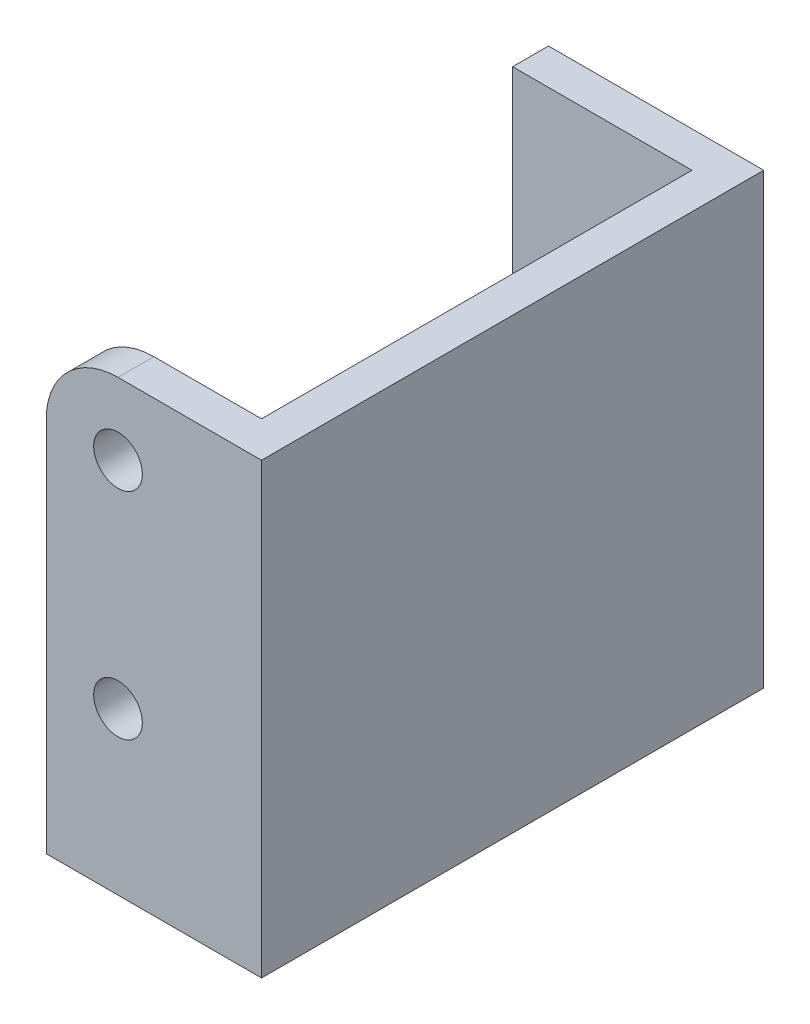
ISO-10303-21;
HEADER;
FILE_DESCRIPTION(('STEP AP214'),'2;1');
FILE_NAME('part.step','',(''),(''),'','','');
FILE_SCHEMA(('AUTOMOTIVE_DESIGN { 1 0 10303 214 1 1 1 1 }'));
ENDSEC;
DATA;
#1=APPLICATION_CONTEXT('core data for automotive mechanical design processes');
#2=APPLICATION_PROTOCOL_DEFINITION('international standard','automotive_design',2000,#1);
#3=PRODUCT_CONTEXT('',#1,'mechanical');
#4=PRODUCT('Part','Part','',(#3));
#5=PRODUCT_RELATED_PRODUCT_CATEGORY('part','',(#4));
#6=PRODUCT_DEFINITION_FORMATION('','',#4);
#7=PRODUCT_DEFINITION_CONTEXT('part definition',#1,'design');
#8=PRODUCT_DEFINITION('design','',#6,#7);
#9=PRODUCT_DEFINITION_SHAPE('','',#8);
#10=(LENGTH_UNIT() NAMED_UNIT(*) SI_UNIT(.MILLI.,.METRE.));
#11=(NAMED_UNIT(*) PLANE_ANGLE_UNIT() SI_UNIT($,.RADIAN.));
#12=(NAMED_UNIT(*) SI_UNIT($,.STERADIAN.) SOLID_ANGLE_UNIT());
#13=UNCERTAINTY_MEASURE_WITH_UNIT(LENGTH_MEASURE(1.E-05),#10,'distance_accuracy_value','');
#14=(GEOMETRIC_REPRESENTATION_CONTEXT(3) GLOBAL_UNCERTAINTY_ASSIGNED_CONTEXT((#13)) GLOBAL_UNIT_ASSIGNED_CONTEXT((#10,
#11,#12)) REPRESENTATION_CONTEXT('',''));
#15=CARTESIAN_POINT('',(0.,0.,0.));
#16=DIRECTION('',(0.,0.,1.));
#17=DIRECTION('',(1.,0.,0.));
#18=AXIS2_PLACEMENT_3D('',#15,#16,#17);
#19=CARTESIAN_POINT('',(-9.525,19.84375,-44.45));
#20=DIRECTION('',(-1.,0.,0.));
#21=DIRECTION('',(0.,-1.,0.));
#22=AXIS2_PLACEMENT_3D('',#19,#20,#21);
#23=PLANE('',#22);
#24=DIRECTION('',(0.,-1.,0.));
#25=VECTOR('',#24,1.);
#26=CARTESIAN_POINT('',(-9.525,19.84375,0.));
#27=LINE('',#26,#25);
#28=CARTESIAN_POINT('',(-9.525,13.49375,0.));
#29=VERTEX_POINT('',#28);
#30=CARTESIAN_POINT('',(-9.525,-19.84375,0.));
#31=VERTEX_POINT('',#30);
#32=EDGE_CURVE('E186',#29,#31,#27,.T.);
#33=ORIENTED_EDGE('',*,*,#32,.F.);
#34=DIRECTION('',(0.,0.,1.));
#35=VECTOR('',#34,1.);
#36=CARTESIAN_POINT('',(-9.525,13.49375,-44.45));
#37=LINE('',#36,#35);
#38=CARTESIAN_POINT('',(-9.525,13.49375,-3.175));
#39=VERTEX_POINT('',#38);
#40=EDGE_CURVE('E52',#29,#39,#37,.F.);
#41=ORIENTED_EDGE('',*,*,#40,.T.);
#42=DIRECTION('',(0.,-1.,0.));
#43=VECTOR('',#42,1.);
#44=CARTESIAN_POINT('',(-9.525,0.,-3.175));
#45=LINE('',#44,#43);
#46=CARTESIAN_POINT('',(-9.525,-16.66875,-3.175));
#47=VERTEX_POINT('',#46);
#48=EDGE_CURVE('E154',#39,#47,#45,.T.);
#49=ORIENTED_EDGE('',*,*,#48,.T.);
#50=DIRECTION('',(0.,0.,1.));
#51=VECTOR('',#50,1.);
#52=CARTESIAN_POINT('',(-9.525,-16.66875,-44.45));
#53=LINE('',#52,#51);
#54=CARTESIAN_POINT('',(-9.525,-16.66875,-41.275));
#55=VERTEX_POINT('',#54);
#56=EDGE_CURVE('E127',#55,#47,#53,.T.);
#57=ORIENTED_EDGE('',*,*,#56,.F.);
#58=DIRECTION('',(0.,-1.,0.));
#59=VECTOR('',#58,1.);
#60=CARTESIAN_POINT('',(-9.525,0.,-41.275));
#61=LINE('',#60,#59);
#62=CARTESIAN_POINT('',(-9.525,19.84375,-41.275));
#63=VERTEX_POINT('',#62);
#64=EDGE_CURVE('E141',#63,#55,#61,.T.);
#65=ORIENTED_EDGE('',*,*,#64,.F.);
#66=DIRECTION('',(0.,0.,1.));
#67=VECTOR('',#66,1.);
#68=CARTESIAN_POINT('',(-9.525,19.84375,-44.45));
#69=LINE('',#68,#67);
#70=CARTESIAN_POINT('',(-9.525,19.84375,-44.45));
#71=VERTEX_POINT('',#70);
#72=EDGE_CURVE('E200',#71,#63,#69,.T.);
#73=ORIENTED_EDGE('',*,*,#72,.F.);
#74=DIRECTION('',(0.,-1.,0.));
#75=VECTOR('',#74,1.);
#76=CARTESIAN_POINT('',(-9.525,19.84375,-44.45));
#77=LINE('',#76,#75);
#78=CARTESIAN_POINT('',(-9.525,-19.84375,-44.45));
#79=VERTEX_POINT('',#78);
#80=EDGE_CURVE('E171',#71,#79,#77,.T.);
#81=ORIENTED_EDGE('',*,*,#80,.T.);
#82=DIRECTION('',(0.,0.,1.));
#83=VECTOR('',#82,1.);
#84=CARTESIAN_POINT('',(-9.525,-19.84375,-44.45));
#85=LINE('',#84,#83);
#86=EDGE_CURVE('E196',#79,#31,#85,.T.);
#87=ORIENTED_EDGE('',*,*,#86,.T.);
#88=EDGE_LOOP('',(#33,#41,#49,#57,#65,#73,#81,#87));
#89=FACE_BOUND('',#88,.T.);
#90=ADVANCED_FACE('F43',(#89),#23,.T.);
#91=CARTESIAN_POINT('',(-9.525,19.84375,-44.45));
#92=DIRECTION('',(0.,1.,0.));
#93=DIRECTION('',(0.,0.,1.));
#94=AXIS2_PLACEMENT_3D('',#91,#92,#93);
#95=PLANE('',#94);
#96=DIRECTION('',(-1.,0.,0.));
#97=VECTOR('',#96,1.);
#98=CARTESIAN_POINT('',(0.,19.84375,-3.175));
#99=LINE('',#98,#97);
#100=CARTESIAN_POINT('',(6.35,19.84375,-3.175));
#101=VERTEX_POINT('',#100);
#102=CARTESIAN_POINT('',(-3.175,19.84375,-3.175));
#103=VERTEX_POINT('',#102);
#104=EDGE_CURVE('E157',#101,#103,#99,.T.);
#105=ORIENTED_EDGE('',*,*,#104,.T.);
#106=DIRECTION('',(0.,0.,1.));
#107=VECTOR('',#106,1.);
#108=CARTESIAN_POINT('',(-3.175,19.84375,-44.45));
#109=LINE('',#108,#107);
#110=CARTESIAN_POINT('',(-3.175,19.84375,0.));
#111=VERTEX_POINT('',#110);
#112=EDGE_CURVE('E195',#103,#111,#109,.T.);
#113=ORIENTED_EDGE('',*,*,#112,.T.);
#114=DIRECTION('',(-1.,0.,0.));
#115=VECTOR('',#114,1.);
#116=CARTESIAN_POINT('',(-9.525,19.84375,0.));
#117=LINE('',#116,#115);
#118=CARTESIAN_POINT('',(9.525,19.84375,0.));
#119=VERTEX_POINT('',#118);
#120=EDGE_CURVE('E183',#119,#111,#117,.T.);
#121=ORIENTED_EDGE('',*,*,#120,.F.);
#122=DIRECTION('',(0.,0.,1.));
#123=VECTOR('',#122,1.);
#124=CARTESIAN_POINT('',(9.525,19.84375,-44.45));
#125=LINE('',#124,#123);
#126=CARTESIAN_POINT('',(9.525,19.84375,-44.45));
#127=VERTEX_POINT('',#126);
#128=EDGE_CURVE('E179',#127,#119,#125,.T.);
#129=ORIENTED_EDGE('',*,*,#128,.F.);
#130=DIRECTION('',(-1.,0.,0.));
#131=VECTOR('',#130,1.);
#132=CARTESIAN_POINT('',(-9.525,19.84375,-44.45));
#133=LINE('',#132,#131);
#134=EDGE_CURVE('E166',#127,#71,#133,.T.);
#135=ORIENTED_EDGE('',*,*,#134,.T.);
#136=ORIENTED_EDGE('',*,*,#72,.T.);
#137=DIRECTION('',(-1.,0.,0.));
#138=VECTOR('',#137,1.);
#139=CARTESIAN_POINT('',(0.,19.84375,-41.275));
#140=LINE('',#139,#138);
#141=CARTESIAN_POINT('',(6.35,19.84375,-41.275));
#142=VERTEX_POINT('',#141);
#143=EDGE_CURVE('E137',#142,#63,#140,.T.);
#144=ORIENTED_EDGE('',*,*,#143,.F.);
#145=DIRECTION('',(0.,0.,1.));
#146=VECTOR('',#145,1.);
#147=CARTESIAN_POINT('',(6.35,19.84375,-44.45));
#148=LINE('',#147,#146);
#149=EDGE_CURVE('E133',#142,#101,#148,.T.);
#150=ORIENTED_EDGE('',*,*,#149,.T.);
#151=EDGE_LOOP('',(#105,#113,#121,#129,#135,#136,#144,#150));
#152=FACE_BOUND('',#151,.T.);
#153=ADVANCED_FACE('F214',(#152),#95,.T.);
#154=CARTESIAN_POINT('',(9.525,19.84375,-44.45));
#155=DIRECTION('',(1.,0.,0.));
#156=DIRECTION('',(0.,1.,0.));
#157=AXIS2_PLACEMENT_3D('',#154,#155,#156);
#158=PLANE('',#157);
#159=DIRECTION('',(0.,1.,0.));
#160=VECTOR('',#159,1.);
#161=CARTESIAN_POINT('',(9.525,19.84375,0.));
#162=LINE('',#161,#160);
#163=CARTESIAN_POINT('',(9.525,-19.84375,0.));
#164=VERTEX_POINT('',#163);
#165=EDGE_CURVE('E126',#164,#119,#162,.T.);
#166=ORIENTED_EDGE('',*,*,#165,.F.);
#167=DIRECTION('',(0.,0.,1.));
#168=VECTOR('',#167,1.);
#169=CARTESIAN_POINT('',(9.525,-19.84375,-44.45));
#170=LINE('',#169,#168);
#171=CARTESIAN_POINT('',(9.525,-19.84375,-44.45));
#172=VERTEX_POINT('',#171);
#173=EDGE_CURVE('E192',#172,#164,#170,.T.);
#174=ORIENTED_EDGE('',*,*,#173,.F.);
#175=DIRECTION('',(0.,1.,0.));
#176=VECTOR('',#175,1.);
#177=CARTESIAN_POINT('',(9.525,19.84375,-44.45));
#178=LINE('',#177,#176);
#179=EDGE_CURVE('E162',#172,#127,#178,.T.);
#180=ORIENTED_EDGE('',*,*,#179,.T.);
#181=ORIENTED_EDGE('',*,*,#128,.T.);
#182=EDGE_LOOP('',(#166,#174,#180,#181));
#183=FACE_BOUND('',#182,.T.);
#184=ADVANCED_FACE('F221',(#183),#158,.T.);
#185=CARTESIAN_POINT('',(-9.525,-19.84375,-44.45));
#186=DIRECTION('',(0.,-1.,0.));
#187=DIRECTION('',(0.,0.,-1.));
#188=AXIS2_PLACEMENT_3D('',#185,#186,#187);
#189=PLANE('',#188);
#190=DIRECTION('',(1.,0.,0.));
#191=VECTOR('',#190,1.);
#192=CARTESIAN_POINT('',(-9.525,-19.84375,0.));
#193=LINE('',#192,#191);
#194=EDGE_CURVE('E167',#31,#164,#193,.T.);
#195=ORIENTED_EDGE('',*,*,#194,.F.);
#196=ORIENTED_EDGE('',*,*,#86,.F.);
#197=DIRECTION('',(1.,0.,0.));
#198=VECTOR('',#197,1.);
#199=CARTESIAN_POINT('',(-9.525,-19.84375,-44.45));
#200=LINE('',#199,#198);
#201=EDGE_CURVE('E175',#79,#172,#200,.T.);
#202=ORIENTED_EDGE('',*,*,#201,.T.);
#203=ORIENTED_EDGE('',*,*,#173,.T.);
#204=EDGE_LOOP('',(#195,#196,#202,#203));
#205=FACE_BOUND('',#204,.T.);
#206=ADVANCED_FACE('F273',(#205),#189,.T.);
#207=CARTESIAN_POINT('',(0.,0.,-44.45));
#208=DIRECTION('',(0.,0.,1.));
#209=DIRECTION('',(1.,0.,0.));
#210=AXIS2_PLACEMENT_3D('',#207,#208,#209);
#211=PLANE('',#210);
#212=ORIENTED_EDGE('',*,*,#179,.F.);
#213=ORIENTED_EDGE('',*,*,#201,.F.);
#214=ORIENTED_EDGE('',*,*,#80,.F.);
#215=ORIENTED_EDGE('',*,*,#134,.F.);
#216=EDGE_LOOP('',(#212,#213,#214,#215));
#217=FACE_BOUND('',#216,.T.);
#218=ADVANCED_FACE('F226',(#217),#211,.F.);
#219=CARTESIAN_POINT('',(0.,0.,0.));
#220=DIRECTION('',(0.,0.,1.));
#221=DIRECTION('',(1.,0.,0.));
#222=AXIS2_PLACEMENT_3D('',#219,#220,#221);
#223=PLANE('',#222);
#224=CARTESIAN_POINT('',(-3.175,-5.55625,0.));
#225=DIRECTION('',(0.,0.,1.));
#226=DIRECTION('',(1.,0.,0.));
#227=AXIS2_PLACEMENT_3D('',#224,#225,#226);
#228=CIRCLE('',#227,2.15265);
#229=CARTESIAN_POINT('',(-1.02235,-5.55625,0.));
#230=VERTEX_POINT('',#229);
#231=EDGE_CURVE('E237',#230,#230,#228,.T.);
#232=ORIENTED_EDGE('',*,*,#231,.F.);
#233=EDGE_LOOP('',(#232));
#234=FACE_BOUND('',#233,.T.);
#235=CARTESIAN_POINT('',(-3.175,13.49375,0.));
#236=DIRECTION('',(0.,0.,1.));
#237=DIRECTION('',(1.,0.,0.));
#238=AXIS2_PLACEMENT_3D('',#235,#236,#237);
#239=CIRCLE('',#238,2.15265);
#240=CARTESIAN_POINT('',(-1.02235,13.49375,0.));
#241=VERTEX_POINT('',#240);
#242=EDGE_CURVE('E241',#241,#241,#239,.T.);
#243=ORIENTED_EDGE('',*,*,#242,.F.);
#244=EDGE_LOOP('',(#243));
#245=FACE_BOUND('',#244,.T.);
#246=ORIENTED_EDGE('',*,*,#120,.T.);
#247=CARTESIAN_POINT('',(-3.175,13.49375,0.));
#248=DIRECTION('',(0.,0.,1.));
#249=DIRECTION('',(1.,0.,0.));
#250=AXIS2_PLACEMENT_3D('',#247,#248,#249);
#251=CIRCLE('',#250,6.35);
#252=EDGE_CURVE('E66',#111,#29,#251,.T.);
#253=ORIENTED_EDGE('',*,*,#252,.T.);
#254=ORIENTED_EDGE('',*,*,#32,.T.);
#255=ORIENTED_EDGE('',*,*,#194,.T.);
#256=ORIENTED_EDGE('',*,*,#165,.T.);
#257=EDGE_LOOP('',(#246,#253,#254,#255,#256));
#258=FACE_BOUND('',#257,.T.);
#259=ADVANCED_FACE('F217',(#234,#245,#258),#223,.T.);
#260=CARTESIAN_POINT('',(6.35,19.84375,-44.45));
#261=DIRECTION('',(1.,0.,0.));
#262=DIRECTION('',(0.,1.,0.));
#263=AXIS2_PLACEMENT_3D('',#260,#261,#262);
#264=PLANE('',#263);
#265=DIRECTION('',(0.,1.,0.));
#266=VECTOR('',#265,1.);
#267=CARTESIAN_POINT('',(6.35,0.,-3.175));
#268=LINE('',#267,#266);
#269=CARTESIAN_POINT('',(6.35,-16.66875,-3.175));
#270=VERTEX_POINT('',#269);
#271=EDGE_CURVE('E161',#270,#101,#268,.T.);
#272=ORIENTED_EDGE('',*,*,#271,.T.);
#273=ORIENTED_EDGE('',*,*,#149,.F.);
#274=DIRECTION('',(0.,1.,0.));
#275=VECTOR('',#274,1.);
#276=CARTESIAN_POINT('',(6.35,0.,-41.275));
#277=LINE('',#276,#275);
#278=CARTESIAN_POINT('',(6.35,-16.66875,-41.275));
#279=VERTEX_POINT('',#278);
#280=EDGE_CURVE('E130',#279,#142,#277,.T.);
#281=ORIENTED_EDGE('',*,*,#280,.F.);
#282=DIRECTION('',(0.,0.,1.));
#283=VECTOR('',#282,1.);
#284=CARTESIAN_POINT('',(6.35,-16.66875,-44.45));
#285=LINE('',#284,#283);
#286=EDGE_CURVE('E113',#279,#270,#285,.T.);
#287=ORIENTED_EDGE('',*,*,#286,.T.);
#288=EDGE_LOOP('',(#272,#273,#281,#287));
#289=FACE_BOUND('',#288,.T.);
#290=ADVANCED_FACE('F131',(#289),#264,.F.);
#291=CARTESIAN_POINT('',(-9.525,-16.66875,-44.45));
#292=DIRECTION('',(0.,-1.,0.));
#293=DIRECTION('',(0.,0.,-1.));
#294=AXIS2_PLACEMENT_3D('',#291,#292,#293);
#295=PLANE('',#294);
#296=DIRECTION('',(1.,0.,0.));
#297=VECTOR('',#296,1.);
#298=CARTESIAN_POINT('',(0.,-16.66875,-3.175));
#299=LINE('',#298,#297);
#300=EDGE_CURVE('E121',#47,#270,#299,.T.);
#301=ORIENTED_EDGE('',*,*,#300,.T.);
#302=ORIENTED_EDGE('',*,*,#286,.F.);
#303=DIRECTION('',(1.,0.,0.));
#304=VECTOR('',#303,1.);
#305=CARTESIAN_POINT('',(0.,-16.66875,-41.275));
#306=LINE('',#305,#304);
#307=EDGE_CURVE('E118',#55,#279,#306,.T.);
#308=ORIENTED_EDGE('',*,*,#307,.F.);
#309=ORIENTED_EDGE('',*,*,#56,.T.);
#310=EDGE_LOOP('',(#301,#302,#308,#309));
#311=FACE_BOUND('',#310,.T.);
#312=ADVANCED_FACE('F115',(#311),#295,.F.);
#313=CARTESIAN_POINT('',(0.,0.,-41.275));
#314=DIRECTION('',(0.,0.,1.));
#315=DIRECTION('',(1.,0.,0.));
#316=AXIS2_PLACEMENT_3D('',#313,#314,#315);
#317=PLANE('',#316);
#318=ORIENTED_EDGE('',*,*,#280,.T.);
#319=ORIENTED_EDGE('',*,*,#143,.T.);
#320=ORIENTED_EDGE('',*,*,#64,.T.);
#321=ORIENTED_EDGE('',*,*,#307,.T.);
#322=EDGE_LOOP('',(#318,#319,#320,#321));
#323=FACE_BOUND('',#322,.T.);
#324=ADVANCED_FACE('F139',(#323),#317,.T.);
#325=CARTESIAN_POINT('',(0.,0.,-3.175));
#326=DIRECTION('',(0.,0.,1.));
#327=DIRECTION('',(1.,0.,0.));
#328=AXIS2_PLACEMENT_3D('',#325,#326,#327);
#329=PLANE('',#328);
#330=CARTESIAN_POINT('',(-3.175,-5.55625,-3.175));
#331=DIRECTION('',(0.,0.,1.));
#332=DIRECTION('',(1.,0.,0.));
#333=AXIS2_PLACEMENT_3D('',#330,#331,#332);
#334=CIRCLE('',#333,2.15265);
#335=CARTESIAN_POINT('',(-1.02235,-5.55625,-3.175));
#336=VERTEX_POINT('',#335);
#337=EDGE_CURVE('E233',#336,#336,#334,.F.);
#338=ORIENTED_EDGE('',*,*,#337,.F.);
#339=EDGE_LOOP('',(#338));
#340=FACE_BOUND('',#339,.T.);
#341=CARTESIAN_POINT('',(-3.175,13.49375,-3.175));
#342=DIRECTION('',(0.,0.,1.));
#343=DIRECTION('',(1.,0.,0.));
#344=AXIS2_PLACEMENT_3D('',#341,#342,#343);
#345=CIRCLE('',#344,2.15265);
#346=CARTESIAN_POINT('',(-1.02235,13.49375,-3.175));
#347=VERTEX_POINT('',#346);
#348=EDGE_CURVE('E245',#347,#347,#345,.F.);
#349=ORIENTED_EDGE('',*,*,#348,.F.);
#350=EDGE_LOOP('',(#349));
#351=FACE_BOUND('',#350,.T.);
#352=ORIENTED_EDGE('',*,*,#48,.F.);
#353=CARTESIAN_POINT('',(-3.175,13.49375,-3.175));
#354=DIRECTION('',(0.,0.,1.));
#355=DIRECTION('',(1.,0.,0.));
#356=AXIS2_PLACEMENT_3D('',#353,#354,#355);
#357=CIRCLE('',#356,6.35);
#358=EDGE_CURVE('E11',#39,#103,#357,.F.);
#359=ORIENTED_EDGE('',*,*,#358,.T.);
#360=ORIENTED_EDGE('',*,*,#104,.F.);
#361=ORIENTED_EDGE('',*,*,#271,.F.);
#362=ORIENTED_EDGE('',*,*,#300,.F.);
#363=EDGE_LOOP('',(#352,#359,#360,#361,#362));
#364=FACE_BOUND('',#363,.T.);
#365=ADVANCED_FACE('F229',(#340,#351,#364),#329,.F.);
#366=CARTESIAN_POINT('',(-3.175,13.49375,-44.451));
#367=DIRECTION('',(0.,0.,1.));
#368=DIRECTION('',(1.,0.,0.));
#369=AXIS2_PLACEMENT_3D('',#366,#367,#368);
#370=CYLINDRICAL_SURFACE('',#369,2.15265);
#371=ORIENTED_EDGE('',*,*,#242,.T.);
#372=EDGE_LOOP('',(#371));
#373=FACE_BOUND('',#372,.T.);
#374=ORIENTED_EDGE('',*,*,#348,.T.);
#375=EDGE_LOOP('',(#374));
#376=FACE_BOUND('',#375,.T.);
#377=ADVANCED_FACE('F251',(#373,#376),#370,.F.);
#378=CARTESIAN_POINT('',(-3.175,-5.55625,-44.451));
#379=DIRECTION('',(0.,0.,1.));
#380=DIRECTION('',(1.,0.,0.));
#381=AXIS2_PLACEMENT_3D('',#378,#379,#380);
#382=CYLINDRICAL_SURFACE('',#381,2.15265);
#383=ORIENTED_EDGE('',*,*,#231,.T.);
#384=EDGE_LOOP('',(#383));
#385=FACE_BOUND('',#384,.T.);
#386=ORIENTED_EDGE('',*,*,#337,.T.);
#387=EDGE_LOOP('',(#386));
#388=FACE_BOUND('',#387,.T.);
#389=ADVANCED_FACE('F260',(#385,#388),#382,.F.);
#390=CARTESIAN_POINT('',(-3.175,13.49375,-44.45));
#391=DIRECTION('',(0.,0.,1.));
#392=DIRECTION('',(1.,0.,0.));
#393=AXIS2_PLACEMENT_3D('',#390,#391,#392);
#394=CYLINDRICAL_SURFACE('',#393,6.35);
#395=ORIENTED_EDGE('',*,*,#358,.F.);
#396=ORIENTED_EDGE('',*,*,#40,.F.);
#397=ORIENTED_EDGE('',*,*,#252,.F.);
#398=ORIENTED_EDGE('',*,*,#112,.F.);
#399=EDGE_LOOP('',(#395,#396,#397,#398));
#400=FACE_BOUND('',#399,.T.);
#401=ADVANCED_FACE('F45',(#400),#394,.T.);
#402=CLOSED_SHELL('',(#90,#153,#184,#206,#218,#259,#290,#312,#324,#365,#377,#389,#401));
#403=MANIFOLD_SOLID_BREP('B2',#402);
#404=ADVANCED_BREP_SHAPE_REPRESENTATION('',(#18,#403),#14);
#405=SHAPE_DEFINITION_REPRESENTATION(#9,#404);
ENDSEC;
END-ISO-10303-21;
